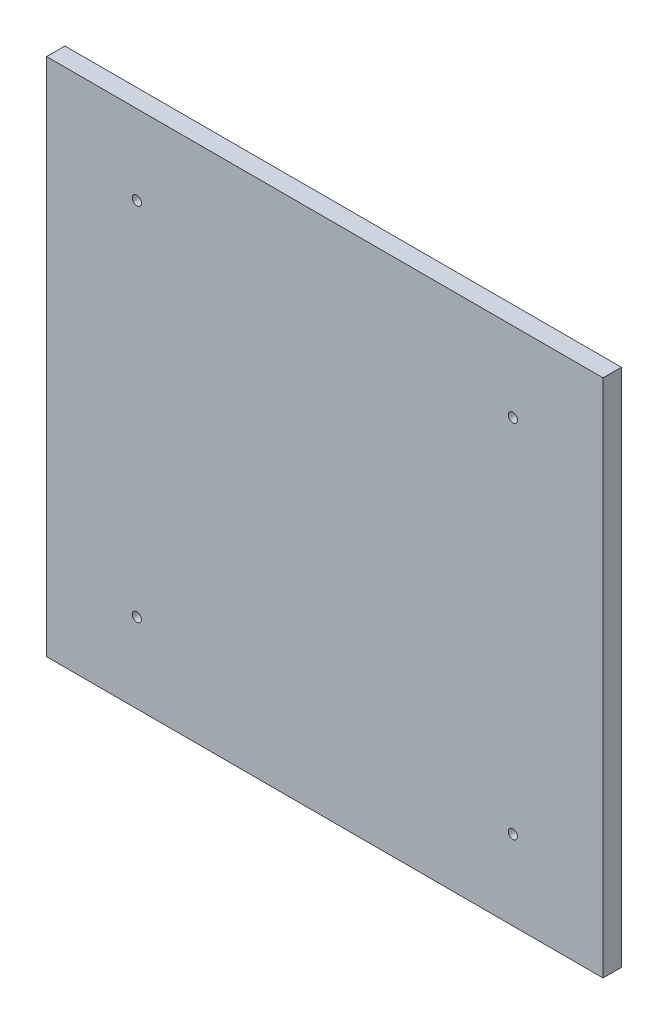
ISO-10303-21;
HEADER;
FILE_DESCRIPTION(('STEP AP214'),'2;1');
FILE_NAME('part.step','',(''),(''),'','','');
FILE_SCHEMA(('AUTOMOTIVE_DESIGN { 1 0 10303 214 1 1 1 1 }'));
ENDSEC;
DATA;
#1=APPLICATION_CONTEXT('core data for automotive mechanical design processes');
#2=APPLICATION_PROTOCOL_DEFINITION('international standard','automotive_design',2000,#1);
#3=PRODUCT_CONTEXT('',#1,'mechanical');
#4=PRODUCT('Part','Part','',(#3));
#5=PRODUCT_RELATED_PRODUCT_CATEGORY('part','',(#4));
#6=PRODUCT_DEFINITION_FORMATION('','',#4);
#7=PRODUCT_DEFINITION_CONTEXT('part definition',#1,'design');
#8=PRODUCT_DEFINITION('design','',#6,#7);
#9=PRODUCT_DEFINITION_SHAPE('','',#8);
#10=(LENGTH_UNIT() NAMED_UNIT(*) SI_UNIT(.MILLI.,.METRE.));
#11=(NAMED_UNIT(*) PLANE_ANGLE_UNIT() SI_UNIT($,.RADIAN.));
#12=(NAMED_UNIT(*) SI_UNIT($,.STERADIAN.) SOLID_ANGLE_UNIT());
#13=UNCERTAINTY_MEASURE_WITH_UNIT(LENGTH_MEASURE(1.E-05),#10,'distance_accuracy_value','');
#14=(GEOMETRIC_REPRESENTATION_CONTEXT(3) GLOBAL_UNCERTAINTY_ASSIGNED_CONTEXT((#13)) GLOBAL_UNIT_ASSIGNED_CONTEXT((#10,
#11,#12)) REPRESENTATION_CONTEXT('',''));
#15=CARTESIAN_POINT('',(0.,0.,0.));
#16=DIRECTION('',(0.,0.,1.));
#17=DIRECTION('',(1.,0.,0.));
#18=AXIS2_PLACEMENT_3D('',#15,#16,#17);
#19=CARTESIAN_POINT('',(0.,0.,6.));
#20=DIRECTION('',(0.,0.,1.));
#21=DIRECTION('',(1.,0.,0.));
#22=AXIS2_PLACEMENT_3D('',#19,#20,#21);
#23=PLANE('',#22);
#24=CARTESIAN_POINT('',(61.5,-59.,6.));
#25=DIRECTION('',(0.,0.,1.));
#26=DIRECTION('',(-1.,0.,0.));
#27=AXIS2_PLACEMENT_3D('',#24,#25,#26);
#28=CIRCLE('',#27,1.5);
#29=CARTESIAN_POINT('',(60.,-59.,6.));
#30=VERTEX_POINT('',#29);
#31=EDGE_CURVE('E124',#30,#30,#28,.T.);
#32=ORIENTED_EDGE('',*,*,#31,.F.);
#33=EDGE_LOOP('',(#32));
#34=FACE_BOUND('',#33,.T.);
#35=CARTESIAN_POINT('',(-61.5,59.,6.));
#36=DIRECTION('',(0.,0.,1.));
#37=DIRECTION('',(1.,0.,0.));
#38=AXIS2_PLACEMENT_3D('',#35,#36,#37);
#39=CIRCLE('',#38,1.5);
#40=CARTESIAN_POINT('',(-60.,59.,6.));
#41=VERTEX_POINT('',#40);
#42=EDGE_CURVE('E103',#41,#41,#39,.T.);
#43=ORIENTED_EDGE('',*,*,#42,.F.);
#44=EDGE_LOOP('',(#43));
#45=FACE_BOUND('',#44,.T.);
#46=DIRECTION('',(0.,-1.,0.));
#47=VECTOR('',#46,1.);
#48=CARTESIAN_POINT('',(-91.,-85.,6.));
#49=LINE('',#48,#47);
#50=CARTESIAN_POINT('',(-91.,85.,6.));
#51=VERTEX_POINT('',#50);
#52=CARTESIAN_POINT('',(-91.,-85.,6.));
#53=VERTEX_POINT('',#52);
#54=EDGE_CURVE('E88',#51,#53,#49,.T.);
#55=ORIENTED_EDGE('',*,*,#54,.T.);
#56=DIRECTION('',(1.,0.,0.));
#57=VECTOR('',#56,1.);
#58=CARTESIAN_POINT('',(91.,-85.,6.));
#59=LINE('',#58,#57);
#60=CARTESIAN_POINT('',(91.,-85.,6.));
#61=VERTEX_POINT('',#60);
#62=EDGE_CURVE('E83',#53,#61,#59,.T.);
#63=ORIENTED_EDGE('',*,*,#62,.T.);
#64=DIRECTION('',(0.,1.,0.));
#65=VECTOR('',#64,1.);
#66=CARTESIAN_POINT('',(91.,-85.,6.));
#67=LINE('',#66,#65);
#68=CARTESIAN_POINT('',(91.,85.,6.));
#69=VERTEX_POINT('',#68);
#70=EDGE_CURVE('E86',#61,#69,#67,.T.);
#71=ORIENTED_EDGE('',*,*,#70,.T.);
#72=DIRECTION('',(-1.,0.,0.));
#73=VECTOR('',#72,1.);
#74=CARTESIAN_POINT('',(91.,85.,6.));
#75=LINE('',#74,#73);
#76=EDGE_CURVE('E53',#69,#51,#75,.T.);
#77=ORIENTED_EDGE('',*,*,#76,.T.);
#78=EDGE_LOOP('',(#55,#63,#71,#77));
#79=FACE_BOUND('',#78,.T.);
#80=CARTESIAN_POINT('',(61.5,59.,6.));
#81=DIRECTION('',(0.,0.,1.));
#82=DIRECTION('',(1.,0.,0.));
#83=AXIS2_PLACEMENT_3D('',#80,#81,#82);
#84=CIRCLE('',#83,1.5);
#85=CARTESIAN_POINT('',(63.,59.,6.));
#86=VERTEX_POINT('',#85);
#87=EDGE_CURVE('E118',#86,#86,#84,.T.);
#88=ORIENTED_EDGE('',*,*,#87,.F.);
#89=EDGE_LOOP('',(#88));
#90=FACE_BOUND('',#89,.T.);
#91=CARTESIAN_POINT('',(-61.5,-59.,6.));
#92=DIRECTION('',(0.,0.,1.));
#93=DIRECTION('',(-1.,0.,0.));
#94=AXIS2_PLACEMENT_3D('',#91,#92,#93);
#95=CIRCLE('',#94,1.5);
#96=CARTESIAN_POINT('',(-63.,-59.,6.));
#97=VERTEX_POINT('',#96);
#98=EDGE_CURVE('E130',#97,#97,#95,.T.);
#99=ORIENTED_EDGE('',*,*,#98,.F.);
#100=EDGE_LOOP('',(#99));
#101=FACE_BOUND('',#100,.T.);
#102=ADVANCED_FACE('F36',(#34,#45,#79,#90,#101),#23,.T.);
#103=CARTESIAN_POINT('',(0.,0.,0.));
#104=DIRECTION('',(0.,0.,1.));
#105=DIRECTION('',(1.,0.,0.));
#106=AXIS2_PLACEMENT_3D('',#103,#104,#105);
#107=PLANE('',#106);
#108=DIRECTION('',(0.,-1.,0.));
#109=VECTOR('',#108,1.);
#110=CARTESIAN_POINT('',(-91.,-85.,0.));
#111=LINE('',#110,#109);
#112=CARTESIAN_POINT('',(-91.,85.,0.));
#113=VERTEX_POINT('',#112);
#114=CARTESIAN_POINT('',(-91.,-85.,0.));
#115=VERTEX_POINT('',#114);
#116=EDGE_CURVE('E100',#113,#115,#111,.T.);
#117=ORIENTED_EDGE('',*,*,#116,.F.);
#118=DIRECTION('',(-1.,0.,0.));
#119=VECTOR('',#118,1.);
#120=CARTESIAN_POINT('',(91.,85.,0.));
#121=LINE('',#120,#119);
#122=CARTESIAN_POINT('',(91.,85.,0.));
#123=VERTEX_POINT('',#122);
#124=EDGE_CURVE('E76',#123,#113,#121,.T.);
#125=ORIENTED_EDGE('',*,*,#124,.F.);
#126=DIRECTION('',(0.,1.,0.));
#127=VECTOR('',#126,1.);
#128=CARTESIAN_POINT('',(91.,-85.,0.));
#129=LINE('',#128,#127);
#130=CARTESIAN_POINT('',(91.,-85.,0.));
#131=VERTEX_POINT('',#130);
#132=EDGE_CURVE('E70',#131,#123,#129,.T.);
#133=ORIENTED_EDGE('',*,*,#132,.F.);
#134=DIRECTION('',(1.,0.,0.));
#135=VECTOR('',#134,1.);
#136=CARTESIAN_POINT('',(91.,-85.,0.));
#137=LINE('',#136,#135);
#138=EDGE_CURVE('E92',#115,#131,#137,.T.);
#139=ORIENTED_EDGE('',*,*,#138,.F.);
#140=EDGE_LOOP('',(#117,#125,#133,#139));
#141=FACE_BOUND('',#140,.T.);
#142=CARTESIAN_POINT('',(-61.5,59.,0.));
#143=DIRECTION('',(0.,0.,1.));
#144=DIRECTION('',(1.,0.,0.));
#145=AXIS2_PLACEMENT_3D('',#142,#143,#144);
#146=CIRCLE('',#145,1.5);
#147=CARTESIAN_POINT('',(-60.,59.,0.));
#148=VERTEX_POINT('',#147);
#149=EDGE_CURVE('E115',#148,#148,#146,.T.);
#150=ORIENTED_EDGE('',*,*,#149,.T.);
#151=EDGE_LOOP('',(#150));
#152=FACE_BOUND('',#151,.T.);
#153=CARTESIAN_POINT('',(61.5,59.,0.));
#154=DIRECTION('',(0.,0.,1.));
#155=DIRECTION('',(1.,0.,0.));
#156=AXIS2_PLACEMENT_3D('',#153,#154,#155);
#157=CIRCLE('',#156,1.5);
#158=CARTESIAN_POINT('',(63.,59.,0.));
#159=VERTEX_POINT('',#158);
#160=EDGE_CURVE('E121',#159,#159,#157,.T.);
#161=ORIENTED_EDGE('',*,*,#160,.T.);
#162=EDGE_LOOP('',(#161));
#163=FACE_BOUND('',#162,.T.);
#164=CARTESIAN_POINT('',(61.5,-59.,0.));
#165=DIRECTION('',(0.,0.,1.));
#166=DIRECTION('',(-1.,0.,0.));
#167=AXIS2_PLACEMENT_3D('',#164,#165,#166);
#168=CIRCLE('',#167,1.5);
#169=CARTESIAN_POINT('',(60.,-59.,0.));
#170=VERTEX_POINT('',#169);
#171=EDGE_CURVE('E127',#170,#170,#168,.T.);
#172=ORIENTED_EDGE('',*,*,#171,.T.);
#173=EDGE_LOOP('',(#172));
#174=FACE_BOUND('',#173,.T.);
#175=CARTESIAN_POINT('',(-61.5,-59.,0.));
#176=DIRECTION('',(0.,0.,1.));
#177=DIRECTION('',(-1.,0.,0.));
#178=AXIS2_PLACEMENT_3D('',#175,#176,#177);
#179=CIRCLE('',#178,1.5);
#180=CARTESIAN_POINT('',(-63.,-59.,0.));
#181=VERTEX_POINT('',#180);
#182=EDGE_CURVE('E133',#181,#181,#179,.T.);
#183=ORIENTED_EDGE('',*,*,#182,.T.);
#184=EDGE_LOOP('',(#183));
#185=FACE_BOUND('',#184,.T.);
#186=ADVANCED_FACE('F111',(#141,#152,#163,#174,#185),#107,.F.);
#187=CARTESIAN_POINT('',(-91.,-85.,6.));
#188=DIRECTION('',(1.,0.,0.));
#189=DIRECTION('',(0.,1.,0.));
#190=AXIS2_PLACEMENT_3D('',#187,#188,#189);
#191=PLANE('',#190);
#192=ORIENTED_EDGE('',*,*,#116,.T.);
#193=DIRECTION('',(0.,0.,-1.));
#194=VECTOR('',#193,1.);
#195=CARTESIAN_POINT('',(-91.,-85.,6.));
#196=LINE('',#195,#194);
#197=EDGE_CURVE('E11',#53,#115,#196,.T.);
#198=ORIENTED_EDGE('',*,*,#197,.F.);
#199=ORIENTED_EDGE('',*,*,#54,.F.);
#200=DIRECTION('',(0.,0.,-1.));
#201=VECTOR('',#200,1.);
#202=CARTESIAN_POINT('',(-91.,85.,6.));
#203=LINE('',#202,#201);
#204=EDGE_CURVE('E96',#51,#113,#203,.T.);
#205=ORIENTED_EDGE('',*,*,#204,.T.);
#206=EDGE_LOOP('',(#192,#198,#199,#205));
#207=FACE_BOUND('',#206,.T.);
#208=ADVANCED_FACE('F38',(#207),#191,.F.);
#209=CARTESIAN_POINT('',(91.,-85.,6.));
#210=DIRECTION('',(0.,1.,0.));
#211=DIRECTION('',(0.,0.,1.));
#212=AXIS2_PLACEMENT_3D('',#209,#210,#211);
#213=PLANE('',#212);
#214=ORIENTED_EDGE('',*,*,#138,.T.);
#215=DIRECTION('',(0.,0.,-1.));
#216=VECTOR('',#215,1.);
#217=CARTESIAN_POINT('',(91.,-85.,6.));
#218=LINE('',#217,#216);
#219=EDGE_CURVE('E45',#61,#131,#218,.T.);
#220=ORIENTED_EDGE('',*,*,#219,.F.);
#221=ORIENTED_EDGE('',*,*,#62,.F.);
#222=ORIENTED_EDGE('',*,*,#197,.T.);
#223=EDGE_LOOP('',(#214,#220,#221,#222));
#224=FACE_BOUND('',#223,.T.);
#225=ADVANCED_FACE('F91',(#224),#213,.F.);
#226=CARTESIAN_POINT('',(91.,-85.,6.));
#227=DIRECTION('',(-1.,0.,0.));
#228=DIRECTION('',(0.,-1.,0.));
#229=AXIS2_PLACEMENT_3D('',#226,#227,#228);
#230=PLANE('',#229);
#231=ORIENTED_EDGE('',*,*,#132,.T.);
#232=DIRECTION('',(0.,0.,-1.));
#233=VECTOR('',#232,1.);
#234=CARTESIAN_POINT('',(91.,85.,6.));
#235=LINE('',#234,#233);
#236=EDGE_CURVE('E93',#69,#123,#235,.T.);
#237=ORIENTED_EDGE('',*,*,#236,.F.);
#238=ORIENTED_EDGE('',*,*,#70,.F.);
#239=ORIENTED_EDGE('',*,*,#219,.T.);
#240=EDGE_LOOP('',(#231,#237,#238,#239));
#241=FACE_BOUND('',#240,.T.);
#242=ADVANCED_FACE('F94',(#241),#230,.F.);
#243=CARTESIAN_POINT('',(91.,85.,6.));
#244=DIRECTION('',(0.,-1.,0.));
#245=DIRECTION('',(1.,0.,0.));
#246=AXIS2_PLACEMENT_3D('',#243,#244,#245);
#247=PLANE('',#246);
#248=ORIENTED_EDGE('',*,*,#124,.T.);
#249=ORIENTED_EDGE('',*,*,#204,.F.);
#250=ORIENTED_EDGE('',*,*,#76,.F.);
#251=ORIENTED_EDGE('',*,*,#236,.T.);
#252=EDGE_LOOP('',(#248,#249,#250,#251));
#253=FACE_BOUND('',#252,.T.);
#254=ADVANCED_FACE('F108',(#253),#247,.F.);
#255=CARTESIAN_POINT('',(-61.5,59.,6.));
#256=DIRECTION('',(0.,0.,-1.));
#257=DIRECTION('',(-1.,0.,0.));
#258=AXIS2_PLACEMENT_3D('',#255,#256,#257);
#259=CYLINDRICAL_SURFACE('',#258,1.5);
#260=ORIENTED_EDGE('',*,*,#42,.T.);
#261=EDGE_LOOP('',(#260));
#262=FACE_BOUND('',#261,.T.);
#263=ORIENTED_EDGE('',*,*,#149,.F.);
#264=EDGE_LOOP('',(#263));
#265=FACE_BOUND('',#264,.T.);
#266=ADVANCED_FACE('F152',(#262,#265),#259,.F.);
#267=CARTESIAN_POINT('',(61.5,59.,6.));
#268=DIRECTION('',(0.,0.,-1.));
#269=DIRECTION('',(-1.,0.,0.));
#270=AXIS2_PLACEMENT_3D('',#267,#268,#269);
#271=CYLINDRICAL_SURFACE('',#270,1.5);
#272=ORIENTED_EDGE('',*,*,#87,.T.);
#273=EDGE_LOOP('',(#272));
#274=FACE_BOUND('',#273,.T.);
#275=ORIENTED_EDGE('',*,*,#160,.F.);
#276=EDGE_LOOP('',(#275));
#277=FACE_BOUND('',#276,.T.);
#278=ADVANCED_FACE('F198',(#274,#277),#271,.F.);
#279=CARTESIAN_POINT('',(61.5,-59.,6.));
#280=DIRECTION('',(0.,0.,-1.));
#281=DIRECTION('',(-1.,0.,0.));
#282=AXIS2_PLACEMENT_3D('',#279,#280,#281);
#283=CYLINDRICAL_SURFACE('',#282,1.5);
#284=ORIENTED_EDGE('',*,*,#31,.T.);
#285=EDGE_LOOP('',(#284));
#286=FACE_BOUND('',#285,.T.);
#287=ORIENTED_EDGE('',*,*,#171,.F.);
#288=EDGE_LOOP('',(#287));
#289=FACE_BOUND('',#288,.T.);
#290=ADVANCED_FACE('F206',(#286,#289),#283,.F.);
#291=CARTESIAN_POINT('',(-61.5,-59.,6.));
#292=DIRECTION('',(0.,0.,-1.));
#293=DIRECTION('',(-1.,0.,0.));
#294=AXIS2_PLACEMENT_3D('',#291,#292,#293);
#295=CYLINDRICAL_SURFACE('',#294,1.5);
#296=ORIENTED_EDGE('',*,*,#98,.T.);
#297=EDGE_LOOP('',(#296));
#298=FACE_BOUND('',#297,.T.);
#299=ORIENTED_EDGE('',*,*,#182,.F.);
#300=EDGE_LOOP('',(#299));
#301=FACE_BOUND('',#300,.T.);
#302=ADVANCED_FACE('F139',(#298,#301),#295,.F.);
#303=CLOSED_SHELL('',(#102,#186,#208,#225,#242,#254,#266,#278,#290,#302));
#304=MANIFOLD_SOLID_BREP('B2',#303);
#305=ADVANCED_BREP_SHAPE_REPRESENTATION('',(#18,#304),#14);
#306=SHAPE_DEFINITION_REPRESENTATION(#9,#305);
ENDSEC;
END-ISO-10303-21;
